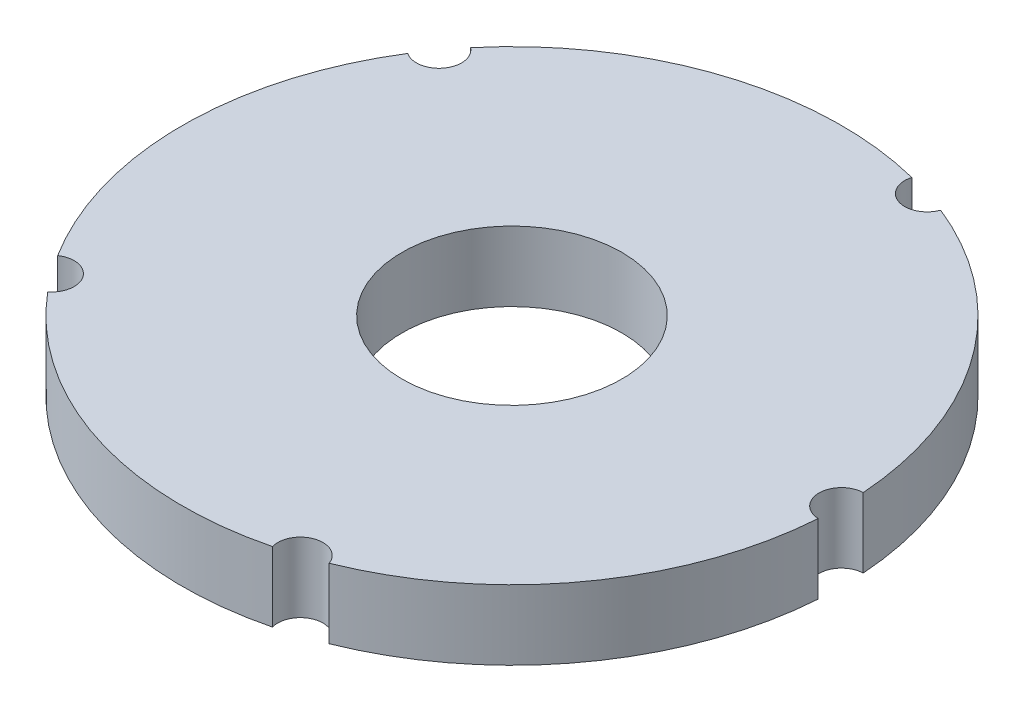
ISO-10303-21;
HEADER;
FILE_DESCRIPTION(('STEP AP214'),'2;1');
FILE_NAME('part.step','',(''),(''),'','','');
FILE_SCHEMA(('AUTOMOTIVE_DESIGN { 1 0 10303 214 1 1 1 1 }'));
ENDSEC;
DATA;
#1=APPLICATION_CONTEXT('core data for automotive mechanical design processes');
#2=APPLICATION_PROTOCOL_DEFINITION('international standard','automotive_design',2000,#1);
#3=PRODUCT_CONTEXT('',#1,'mechanical');
#4=PRODUCT('Part','Part','',(#3));
#5=PRODUCT_RELATED_PRODUCT_CATEGORY('part','',(#4));
#6=PRODUCT_DEFINITION_FORMATION('','',#4);
#7=PRODUCT_DEFINITION_CONTEXT('part definition',#1,'design');
#8=PRODUCT_DEFINITION('design','',#6,#7);
#9=PRODUCT_DEFINITION_SHAPE('','',#8);
#10=(LENGTH_UNIT() NAMED_UNIT(*) SI_UNIT(.MILLI.,.METRE.));
#11=(NAMED_UNIT(*) PLANE_ANGLE_UNIT() SI_UNIT($,.RADIAN.));
#12=(NAMED_UNIT(*) SI_UNIT($,.STERADIAN.) SOLID_ANGLE_UNIT());
#13=UNCERTAINTY_MEASURE_WITH_UNIT(LENGTH_MEASURE(1.E-05),#10,'distance_accuracy_value','');
#14=(GEOMETRIC_REPRESENTATION_CONTEXT(3) GLOBAL_UNCERTAINTY_ASSIGNED_CONTEXT((#13)) GLOBAL_UNIT_ASSIGNED_CONTEXT((#10,
#11,#12)) REPRESENTATION_CONTEXT('',''));
#15=CARTESIAN_POINT('',(0.,0.,0.));
#16=DIRECTION('',(0.,0.,1.));
#17=DIRECTION('',(1.,0.,0.));
#18=AXIS2_PLACEMENT_3D('',#15,#16,#17);
#19=CARTESIAN_POINT('',(15.,6.35,0.));
#20=DIRECTION('',(0.,1.,0.));
#21=DIRECTION('',(0.,0.,1.));
#22=AXIS2_PLACEMENT_3D('',#19,#20,#21);
#23=PLANE('',#22);
#24=CARTESIAN_POINT('',(0.,6.35,0.));
#25=DIRECTION('',(0.,1.,0.));
#26=DIRECTION('',(0.,0.,1.));
#27=AXIS2_PLACEMENT_3D('',#24,#25,#26);
#28=CIRCLE('',#27,30.);
#29=CARTESIAN_POINT('',(11.1973933099847,6.35,27.8319669276447));
#30=VERTEX_POINT('',#29);
#31=CARTESIAN_POINT('',(29.9299583333333,6.35,2.04880310545707));
#32=VERTEX_POINT('',#31);
#33=EDGE_CURVE('E161',#30,#32,#28,.T.);
#34=ORIENTED_EDGE('',*,*,#33,.T.);
#35=CARTESIAN_POINT('',(30.,6.35,0.));
#36=DIRECTION('',(0.,-1.,0.));
#37=DIRECTION('',(0.,0.,1.));
#38=AXIS2_PLACEMENT_3D('',#35,#36,#37);
#39=CIRCLE('',#38,2.04999999999999);
#40=CARTESIAN_POINT('',(29.9299583333333,6.35,-2.04880310545707));
#41=VERTEX_POINT('',#40);
#42=EDGE_CURVE('E99',#32,#41,#39,.T.);
#43=ORIENTED_EDGE('',*,*,#42,.T.);
#44=CARTESIAN_POINT('',(0.,6.35,0.));
#45=DIRECTION('',(0.,1.,0.));
#46=DIRECTION('',(0.,0.,1.));
#47=AXIS2_PLACEMENT_3D('',#44,#45,#46);
#48=CIRCLE('',#47,30.);
#49=CARTESIAN_POINT('',(11.1973933099851,6.35,-27.8319669276446));
#50=VERTEX_POINT('',#49);
#51=EDGE_CURVE('E182',#41,#50,#48,.T.);
#52=ORIENTED_EDGE('',*,*,#51,.T.);
#53=CARTESIAN_POINT('',(9.27050983124875,6.35,-28.5316954888545));
#54=DIRECTION('',(0.,-1.,0.));
#55=DIRECTION('',(0.,0.,1.));
#56=AXIS2_PLACEMENT_3D('',#53,#54,#55);
#57=CIRCLE('',#56,2.04999999999999);
#58=CARTESIAN_POINT('',(7.30033822188371,6.35,-29.0981968830734));
#59=VERTEX_POINT('',#58);
#60=EDGE_CURVE('E201',#50,#59,#57,.T.);
#61=ORIENTED_EDGE('',*,*,#60,.T.);
#62=CARTESIAN_POINT('',(0.,6.35,0.));
#63=DIRECTION('',(0.,1.,0.));
#64=DIRECTION('',(0.,0.,1.));
#65=AXIS2_PLACEMENT_3D('',#62,#63,#64);
#66=CIRCLE('',#65,30.);
#67=CARTESIAN_POINT('',(-23.0095886823619,6.35,-19.2499046405047));
#68=VERTEX_POINT('',#67);
#69=EDGE_CURVE('E198',#59,#68,#66,.T.);
#70=ORIENTED_EDGE('',*,*,#69,.T.);
#71=CARTESIAN_POINT('',(-24.2705098312483,6.35,-17.6335575687744));
#72=DIRECTION('',(0.,-1.,0.));
#73=DIRECTION('',(0.,0.,1.));
#74=AXIS2_PLACEMENT_3D('',#71,#72,#73);
#75=CIRCLE('',#74,2.04999999999999);
#76=CARTESIAN_POINT('',(-25.4181011828393,6.35,-15.9348715796188));
#77=VERTEX_POINT('',#76);
#78=EDGE_CURVE('E200',#68,#77,#75,.T.);
#79=ORIENTED_EDGE('',*,*,#78,.T.);
#80=CARTESIAN_POINT('',(0.,6.35,0.));
#81=DIRECTION('',(0.,1.,0.));
#82=DIRECTION('',(0.,0.,1.));
#83=AXIS2_PLACEMENT_3D('',#80,#81,#82);
#84=CIRCLE('',#83,30.);
#85=CARTESIAN_POINT('',(-25.4181011828395,6.35,15.9348715796185));
#86=VERTEX_POINT('',#85);
#87=EDGE_CURVE('E124',#77,#86,#84,.T.);
#88=ORIENTED_EDGE('',*,*,#87,.T.);
#89=CARTESIAN_POINT('',(-24.2705098312485,6.35,17.6335575687741));
#90=DIRECTION('',(0.,-1.,0.));
#91=DIRECTION('',(0.,0.,1.));
#92=AXIS2_PLACEMENT_3D('',#89,#90,#91);
#93=CIRCLE('',#92,2.04999999999999);
#94=CARTESIAN_POINT('',(-23.0095886823622,6.35,19.2499046405043));
#95=VERTEX_POINT('',#94);
#96=EDGE_CURVE('E118',#86,#95,#93,.T.);
#97=ORIENTED_EDGE('',*,*,#96,.T.);
#98=CARTESIAN_POINT('',(0.,6.35,0.));
#99=DIRECTION('',(0.,1.,0.));
#100=DIRECTION('',(0.,0.,1.));
#101=AXIS2_PLACEMENT_3D('',#98,#99,#100);
#102=CIRCLE('',#101,30.);
#103=CARTESIAN_POINT('',(7.30033822188332,6.35,29.0981968830735));
#104=VERTEX_POINT('',#103);
#105=EDGE_CURVE('E122',#95,#104,#102,.T.);
#106=ORIENTED_EDGE('',*,*,#105,.T.);
#107=CARTESIAN_POINT('',(9.27050983124835,6.35,28.5316954888546));
#108=DIRECTION('',(0.,-1.,0.));
#109=DIRECTION('',(0.,0.,1.));
#110=AXIS2_PLACEMENT_3D('',#107,#108,#109);
#111=CIRCLE('',#110,2.05);
#112=EDGE_CURVE('E50',#104,#30,#111,.T.);
#113=ORIENTED_EDGE('',*,*,#112,.T.);
#114=EDGE_LOOP('',(#34,#43,#52,#61,#70,#79,#88,#97,#106,#113));
#115=FACE_BOUND('',#114,.T.);
#116=CARTESIAN_POINT('',(0.,6.35,0.));
#117=DIRECTION('',(0.,1.,0.));
#118=DIRECTION('',(0.,0.,1.));
#119=AXIS2_PLACEMENT_3D('',#116,#117,#118);
#120=CIRCLE('',#119,10.);
#121=CARTESIAN_POINT('',(0.,6.35,10.));
#122=VERTEX_POINT('',#121);
#123=EDGE_CURVE('E146',#122,#122,#120,.T.);
#124=ORIENTED_EDGE('',*,*,#123,.F.);
#125=EDGE_LOOP('',(#124));
#126=FACE_BOUND('',#125,.T.);
#127=ADVANCED_FACE('F33',(#115,#126),#23,.T.);
#128=CARTESIAN_POINT('',(15.,0.,0.));
#129=DIRECTION('',(0.,1.,0.));
#130=DIRECTION('',(0.,0.,1.));
#131=AXIS2_PLACEMENT_3D('',#128,#129,#130);
#132=PLANE('',#131);
#133=CARTESIAN_POINT('',(0.,0.,0.));
#134=DIRECTION('',(0.,1.,0.));
#135=DIRECTION('',(0.,0.,1.));
#136=AXIS2_PLACEMENT_3D('',#133,#134,#135);
#137=CIRCLE('',#136,30.);
#138=CARTESIAN_POINT('',(11.1973933099847,0.,27.8319669276447));
#139=VERTEX_POINT('',#138);
#140=CARTESIAN_POINT('',(29.9299583333333,0.,2.04880310545707));
#141=VERTEX_POINT('',#140);
#142=EDGE_CURVE('E142',#139,#141,#137,.T.);
#143=ORIENTED_EDGE('',*,*,#142,.F.);
#144=CARTESIAN_POINT('',(9.27050983124835,0.,28.5316954888546));
#145=DIRECTION('',(0.,-1.,0.));
#146=DIRECTION('',(0.,0.,1.));
#147=AXIS2_PLACEMENT_3D('',#144,#145,#146);
#148=CIRCLE('',#147,2.05);
#149=CARTESIAN_POINT('',(7.30033822188332,0.,29.0981968830735));
#150=VERTEX_POINT('',#149);
#151=EDGE_CURVE('E91',#150,#139,#148,.T.);
#152=ORIENTED_EDGE('',*,*,#151,.F.);
#153=CARTESIAN_POINT('',(0.,0.,0.));
#154=DIRECTION('',(0.,1.,0.));
#155=DIRECTION('',(0.,0.,1.));
#156=AXIS2_PLACEMENT_3D('',#153,#154,#155);
#157=CIRCLE('',#156,30.);
#158=CARTESIAN_POINT('',(-23.0095886823622,0.,19.2499046405043));
#159=VERTEX_POINT('',#158);
#160=EDGE_CURVE('E85',#159,#150,#157,.T.);
#161=ORIENTED_EDGE('',*,*,#160,.F.);
#162=CARTESIAN_POINT('',(-24.2705098312485,0.,17.6335575687741));
#163=DIRECTION('',(0.,-1.,0.));
#164=DIRECTION('',(0.,0.,1.));
#165=AXIS2_PLACEMENT_3D('',#162,#163,#164);
#166=CIRCLE('',#165,2.04999999999999);
#167=CARTESIAN_POINT('',(-25.4181011828395,0.,15.9348715796185));
#168=VERTEX_POINT('',#167);
#169=EDGE_CURVE('E132',#168,#159,#166,.T.);
#170=ORIENTED_EDGE('',*,*,#169,.F.);
#171=CARTESIAN_POINT('',(0.,0.,0.));
#172=DIRECTION('',(0.,1.,0.));
#173=DIRECTION('',(0.,0.,1.));
#174=AXIS2_PLACEMENT_3D('',#171,#172,#173);
#175=CIRCLE('',#174,30.);
#176=CARTESIAN_POINT('',(-25.4181011828393,0.,-15.9348715796188));
#177=VERTEX_POINT('',#176);
#178=EDGE_CURVE('E156',#177,#168,#175,.T.);
#179=ORIENTED_EDGE('',*,*,#178,.F.);
#180=CARTESIAN_POINT('',(-24.2705098312483,0.,-17.6335575687744));
#181=DIRECTION('',(0.,-1.,0.));
#182=DIRECTION('',(0.,0.,1.));
#183=AXIS2_PLACEMENT_3D('',#180,#181,#182);
#184=CIRCLE('',#183,2.04999999999999);
#185=CARTESIAN_POINT('',(-23.0095886823619,0.,-19.2499046405047));
#186=VERTEX_POINT('',#185);
#187=EDGE_CURVE('E154',#186,#177,#184,.T.);
#188=ORIENTED_EDGE('',*,*,#187,.F.);
#189=CARTESIAN_POINT('',(0.,0.,0.));
#190=DIRECTION('',(0.,1.,0.));
#191=DIRECTION('',(0.,0.,1.));
#192=AXIS2_PLACEMENT_3D('',#189,#190,#191);
#193=CIRCLE('',#192,30.);
#194=CARTESIAN_POINT('',(7.30033822188371,0.,-29.0981968830734));
#195=VERTEX_POINT('',#194);
#196=EDGE_CURVE('E152',#195,#186,#193,.T.);
#197=ORIENTED_EDGE('',*,*,#196,.F.);
#198=CARTESIAN_POINT('',(9.27050983124875,0.,-28.5316954888545));
#199=DIRECTION('',(0.,-1.,0.));
#200=DIRECTION('',(0.,0.,1.));
#201=AXIS2_PLACEMENT_3D('',#198,#199,#200);
#202=CIRCLE('',#201,2.04999999999999);
#203=CARTESIAN_POINT('',(11.1973933099851,0.,-27.8319669276446));
#204=VERTEX_POINT('',#203);
#205=EDGE_CURVE('E150',#204,#195,#202,.T.);
#206=ORIENTED_EDGE('',*,*,#205,.F.);
#207=CARTESIAN_POINT('',(0.,0.,0.));
#208=DIRECTION('',(0.,1.,0.));
#209=DIRECTION('',(0.,0.,1.));
#210=AXIS2_PLACEMENT_3D('',#207,#208,#209);
#211=CIRCLE('',#210,30.);
#212=CARTESIAN_POINT('',(29.9299583333333,0.,-2.04880310545707));
#213=VERTEX_POINT('',#212);
#214=EDGE_CURVE('E148',#213,#204,#211,.T.);
#215=ORIENTED_EDGE('',*,*,#214,.F.);
#216=CARTESIAN_POINT('',(30.,0.,0.));
#217=DIRECTION('',(0.,-1.,0.));
#218=DIRECTION('',(0.,0.,1.));
#219=AXIS2_PLACEMENT_3D('',#216,#217,#218);
#220=CIRCLE('',#219,2.04999999999999);
#221=EDGE_CURVE('E145',#141,#213,#220,.T.);
#222=ORIENTED_EDGE('',*,*,#221,.F.);
#223=EDGE_LOOP('',(#143,#152,#161,#170,#179,#188,#197,#206,#215,#222));
#224=FACE_BOUND('',#223,.T.);
#225=CARTESIAN_POINT('',(0.,0.,0.));
#226=DIRECTION('',(0.,1.,0.));
#227=DIRECTION('',(0.,0.,1.));
#228=AXIS2_PLACEMENT_3D('',#225,#226,#227);
#229=CIRCLE('',#228,10.);
#230=CARTESIAN_POINT('',(0.,0.,10.));
#231=VERTEX_POINT('',#230);
#232=EDGE_CURVE('E209',#231,#231,#229,.T.);
#233=ORIENTED_EDGE('',*,*,#232,.T.);
#234=EDGE_LOOP('',(#233));
#235=FACE_BOUND('',#234,.T.);
#236=ADVANCED_FACE('F186',(#224,#235),#132,.F.);
#237=CARTESIAN_POINT('',(0.,6.35,0.));
#238=DIRECTION('',(0.,-1.,0.));
#239=DIRECTION('',(0.,0.,-1.));
#240=AXIS2_PLACEMENT_3D('',#237,#238,#239);
#241=CYLINDRICAL_SURFACE('',#240,30.);
#242=ORIENTED_EDGE('',*,*,#142,.T.);
#243=DIRECTION('',(0.,-1.,0.));
#244=VECTOR('',#243,1.);
#245=CARTESIAN_POINT('',(29.9299583333333,6.35,2.04880310545707));
#246=LINE('',#245,#244);
#247=EDGE_CURVE('E11',#32,#141,#246,.T.);
#248=ORIENTED_EDGE('',*,*,#247,.F.);
#249=ORIENTED_EDGE('',*,*,#33,.F.);
#250=DIRECTION('',(0.,-1.,0.));
#251=VECTOR('',#250,1.);
#252=CARTESIAN_POINT('',(11.1973933099847,6.35,27.8319669276447));
#253=LINE('',#252,#251);
#254=EDGE_CURVE('E138',#30,#139,#253,.T.);
#255=ORIENTED_EDGE('',*,*,#254,.T.);
#256=EDGE_LOOP('',(#242,#248,#249,#255));
#257=FACE_BOUND('',#256,.T.);
#258=ADVANCED_FACE('F35',(#257),#241,.T.);
#259=CARTESIAN_POINT('',(30.,6.35,0.));
#260=DIRECTION('',(0.,-1.,0.));
#261=DIRECTION('',(0.,0.,-1.));
#262=AXIS2_PLACEMENT_3D('',#259,#260,#261);
#263=CYLINDRICAL_SURFACE('',#262,2.04999999999999);
#264=ORIENTED_EDGE('',*,*,#221,.T.);
#265=DIRECTION('',(0.,-1.,0.));
#266=VECTOR('',#265,1.);
#267=CARTESIAN_POINT('',(29.9299583333333,6.35,-2.04880310545707));
#268=LINE('',#267,#266);
#269=EDGE_CURVE('E42',#41,#213,#268,.T.);
#270=ORIENTED_EDGE('',*,*,#269,.F.);
#271=ORIENTED_EDGE('',*,*,#42,.F.);
#272=ORIENTED_EDGE('',*,*,#247,.T.);
#273=EDGE_LOOP('',(#264,#270,#271,#272));
#274=FACE_BOUND('',#273,.T.);
#275=ADVANCED_FACE('F245',(#274),#263,.F.);
#276=CARTESIAN_POINT('',(0.,6.35,0.));
#277=DIRECTION('',(0.,-1.,0.));
#278=DIRECTION('',(0.,0.,-1.));
#279=AXIS2_PLACEMENT_3D('',#276,#277,#278);
#280=CYLINDRICAL_SURFACE('',#279,30.);
#281=ORIENTED_EDGE('',*,*,#214,.T.);
#282=DIRECTION('',(0.,-1.,0.));
#283=VECTOR('',#282,1.);
#284=CARTESIAN_POINT('',(11.1973933099851,6.35,-27.8319669276446));
#285=LINE('',#284,#283);
#286=EDGE_CURVE('E174',#50,#204,#285,.T.);
#287=ORIENTED_EDGE('',*,*,#286,.F.);
#288=ORIENTED_EDGE('',*,*,#51,.F.);
#289=ORIENTED_EDGE('',*,*,#269,.T.);
#290=EDGE_LOOP('',(#281,#287,#288,#289));
#291=FACE_BOUND('',#290,.T.);
#292=ADVANCED_FACE('F180',(#291),#280,.T.);
#293=CARTESIAN_POINT('',(9.27050983124875,6.35,-28.5316954888545));
#294=DIRECTION('',(0.,-1.,0.));
#295=DIRECTION('',(0.,0.,-1.));
#296=AXIS2_PLACEMENT_3D('',#293,#294,#295);
#297=CYLINDRICAL_SURFACE('',#296,2.04999999999999);
#298=ORIENTED_EDGE('',*,*,#205,.T.);
#299=DIRECTION('',(0.,-1.,0.));
#300=VECTOR('',#299,1.);
#301=CARTESIAN_POINT('',(7.30033822188371,6.35,-29.0981968830734));
#302=LINE('',#301,#300);
#303=EDGE_CURVE('E171',#59,#195,#302,.T.);
#304=ORIENTED_EDGE('',*,*,#303,.F.);
#305=ORIENTED_EDGE('',*,*,#60,.F.);
#306=ORIENTED_EDGE('',*,*,#286,.T.);
#307=EDGE_LOOP('',(#298,#304,#305,#306));
#308=FACE_BOUND('',#307,.T.);
#309=ADVANCED_FACE('F192',(#308),#297,.F.);
#310=CARTESIAN_POINT('',(0.,6.35,0.));
#311=DIRECTION('',(0.,-1.,0.));
#312=DIRECTION('',(0.,0.,-1.));
#313=AXIS2_PLACEMENT_3D('',#310,#311,#312);
#314=CYLINDRICAL_SURFACE('',#313,30.);
#315=ORIENTED_EDGE('',*,*,#196,.T.);
#316=DIRECTION('',(0.,-1.,0.));
#317=VECTOR('',#316,1.);
#318=CARTESIAN_POINT('',(-23.0095886823619,6.35,-19.2499046405047));
#319=LINE('',#318,#317);
#320=EDGE_CURVE('E168',#68,#186,#319,.T.);
#321=ORIENTED_EDGE('',*,*,#320,.F.);
#322=ORIENTED_EDGE('',*,*,#69,.F.);
#323=ORIENTED_EDGE('',*,*,#303,.T.);
#324=EDGE_LOOP('',(#315,#321,#322,#323));
#325=FACE_BOUND('',#324,.T.);
#326=ADVANCED_FACE('F196',(#325),#314,.T.);
#327=CARTESIAN_POINT('',(-24.2705098312483,6.35,-17.6335575687744));
#328=DIRECTION('',(0.,-1.,0.));
#329=DIRECTION('',(0.,0.,-1.));
#330=AXIS2_PLACEMENT_3D('',#327,#328,#329);
#331=CYLINDRICAL_SURFACE('',#330,2.04999999999999);
#332=ORIENTED_EDGE('',*,*,#187,.T.);
#333=DIRECTION('',(0.,-1.,0.));
#334=VECTOR('',#333,1.);
#335=CARTESIAN_POINT('',(-25.4181011828393,6.35,-15.9348715796188));
#336=LINE('',#335,#334);
#337=EDGE_CURVE('E165',#77,#177,#336,.T.);
#338=ORIENTED_EDGE('',*,*,#337,.F.);
#339=ORIENTED_EDGE('',*,*,#78,.F.);
#340=ORIENTED_EDGE('',*,*,#320,.T.);
#341=EDGE_LOOP('',(#332,#338,#339,#340));
#342=FACE_BOUND('',#341,.T.);
#343=ADVANCED_FACE('F235',(#342),#331,.F.);
#344=CARTESIAN_POINT('',(0.,6.35,0.));
#345=DIRECTION('',(0.,-1.,0.));
#346=DIRECTION('',(0.,0.,-1.));
#347=AXIS2_PLACEMENT_3D('',#344,#345,#346);
#348=CYLINDRICAL_SURFACE('',#347,30.);
#349=ORIENTED_EDGE('',*,*,#178,.T.);
#350=DIRECTION('',(0.,-1.,0.));
#351=VECTOR('',#350,1.);
#352=CARTESIAN_POINT('',(-25.4181011828395,6.35,15.9348715796185));
#353=LINE('',#352,#351);
#354=EDGE_CURVE('E133',#86,#168,#353,.T.);
#355=ORIENTED_EDGE('',*,*,#354,.F.);
#356=ORIENTED_EDGE('',*,*,#87,.F.);
#357=ORIENTED_EDGE('',*,*,#337,.T.);
#358=EDGE_LOOP('',(#349,#355,#356,#357));
#359=FACE_BOUND('',#358,.T.);
#360=ADVANCED_FACE('F232',(#359),#348,.T.);
#361=CARTESIAN_POINT('',(-24.2705098312485,6.35,17.6335575687741));
#362=DIRECTION('',(0.,-1.,0.));
#363=DIRECTION('',(0.,0.,-1.));
#364=AXIS2_PLACEMENT_3D('',#361,#362,#363);
#365=CYLINDRICAL_SURFACE('',#364,2.04999999999999);
#366=ORIENTED_EDGE('',*,*,#169,.T.);
#367=DIRECTION('',(0.,-1.,0.));
#368=VECTOR('',#367,1.);
#369=CARTESIAN_POINT('',(-23.0095886823622,6.35,19.2499046405043));
#370=LINE('',#369,#368);
#371=EDGE_CURVE('E129',#95,#159,#370,.T.);
#372=ORIENTED_EDGE('',*,*,#371,.F.);
#373=ORIENTED_EDGE('',*,*,#96,.F.);
#374=ORIENTED_EDGE('',*,*,#354,.T.);
#375=EDGE_LOOP('',(#366,#372,#373,#374));
#376=FACE_BOUND('',#375,.T.);
#377=ADVANCED_FACE('F130',(#376),#365,.F.);
#378=CARTESIAN_POINT('',(0.,6.35,0.));
#379=DIRECTION('',(0.,-1.,0.));
#380=DIRECTION('',(0.,0.,-1.));
#381=AXIS2_PLACEMENT_3D('',#378,#379,#380);
#382=CYLINDRICAL_SURFACE('',#381,30.);
#383=ORIENTED_EDGE('',*,*,#160,.T.);
#384=DIRECTION('',(0.,-1.,0.));
#385=VECTOR('',#384,1.);
#386=CARTESIAN_POINT('',(7.30033822188332,6.35,29.0981968830735));
#387=LINE('',#386,#385);
#388=EDGE_CURVE('E134',#104,#150,#387,.T.);
#389=ORIENTED_EDGE('',*,*,#388,.F.);
#390=ORIENTED_EDGE('',*,*,#105,.F.);
#391=ORIENTED_EDGE('',*,*,#371,.T.);
#392=EDGE_LOOP('',(#383,#389,#390,#391));
#393=FACE_BOUND('',#392,.T.);
#394=ADVANCED_FACE('F136',(#393),#382,.T.);
#395=CARTESIAN_POINT('',(9.27050983124835,6.35,28.5316954888546));
#396=DIRECTION('',(0.,-1.,0.));
#397=DIRECTION('',(0.,0.,-1.));
#398=AXIS2_PLACEMENT_3D('',#395,#396,#397);
#399=CYLINDRICAL_SURFACE('',#398,2.05);
#400=ORIENTED_EDGE('',*,*,#151,.T.);
#401=ORIENTED_EDGE('',*,*,#254,.F.);
#402=ORIENTED_EDGE('',*,*,#112,.F.);
#403=ORIENTED_EDGE('',*,*,#388,.T.);
#404=EDGE_LOOP('',(#400,#401,#402,#403));
#405=FACE_BOUND('',#404,.T.);
#406=ADVANCED_FACE('F225',(#405),#399,.F.);
#407=CARTESIAN_POINT('',(0.,6.35,0.));
#408=DIRECTION('',(0.,-1.,0.));
#409=DIRECTION('',(0.,0.,-1.));
#410=AXIS2_PLACEMENT_3D('',#407,#408,#409);
#411=CYLINDRICAL_SURFACE('',#410,10.);
#412=ORIENTED_EDGE('',*,*,#123,.T.);
#413=EDGE_LOOP('',(#412));
#414=FACE_BOUND('',#413,.T.);
#415=ORIENTED_EDGE('',*,*,#232,.F.);
#416=EDGE_LOOP('',(#415));
#417=FACE_BOUND('',#416,.T.);
#418=ADVANCED_FACE('F215',(#414,#417),#411,.F.);
#419=CLOSED_SHELL('',(#127,#236,#258,#275,#292,#309,#326,#343,#360,#377,#394,#406,#418));
#420=MANIFOLD_SOLID_BREP('B2',#419);
#421=ADVANCED_BREP_SHAPE_REPRESENTATION('',(#18,#420),#14);
#422=SHAPE_DEFINITION_REPRESENTATION(#9,#421);
ENDSEC;
END-ISO-10303-21;
